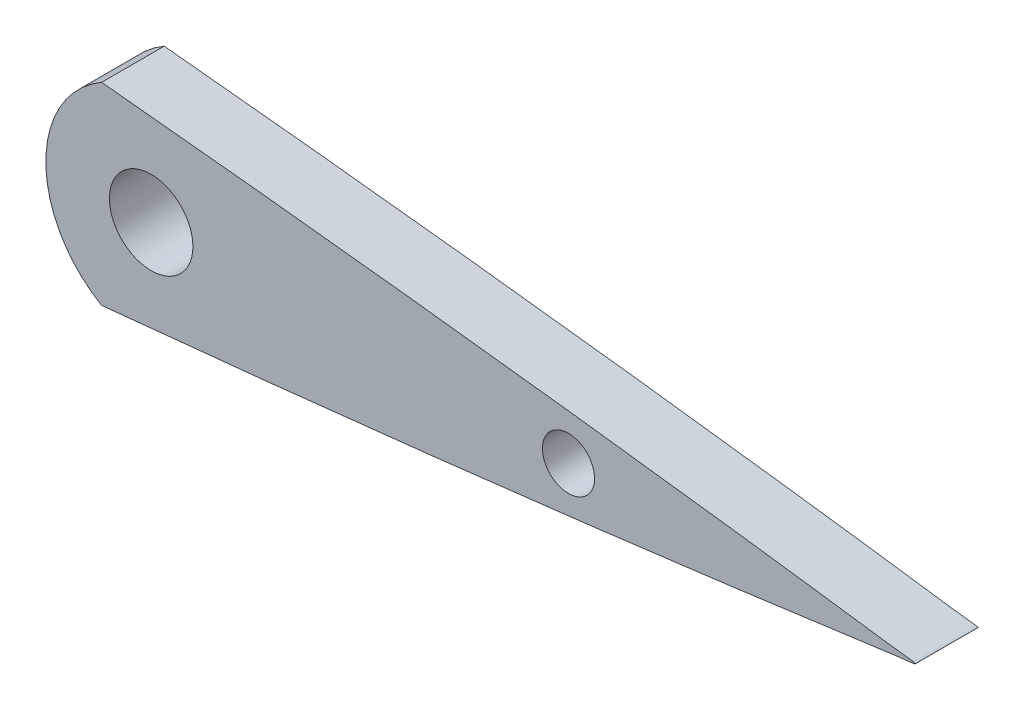
ISO-10303-21;
HEADER;
FILE_DESCRIPTION(('STEP AP214'),'2;1');
FILE_NAME('part.step','',(''),(''),'','','');
FILE_SCHEMA(('AUTOMOTIVE_DESIGN { 1 0 10303 214 1 1 1 1 }'));
ENDSEC;
DATA;
#1=APPLICATION_CONTEXT('core data for automotive mechanical design processes');
#2=APPLICATION_PROTOCOL_DEFINITION('international standard','automotive_design',2000,#1);
#3=PRODUCT_CONTEXT('',#1,'mechanical');
#4=PRODUCT('Part','Part','',(#3));
#5=PRODUCT_RELATED_PRODUCT_CATEGORY('part','',(#4));
#6=PRODUCT_DEFINITION_FORMATION('','',#4);
#7=PRODUCT_DEFINITION_CONTEXT('part definition',#1,'design');
#8=PRODUCT_DEFINITION('design','',#6,#7);
#9=PRODUCT_DEFINITION_SHAPE('','',#8);
#10=(LENGTH_UNIT() NAMED_UNIT(*) SI_UNIT(.MILLI.,.METRE.));
#11=(NAMED_UNIT(*) PLANE_ANGLE_UNIT() SI_UNIT($,.RADIAN.));
#12=(NAMED_UNIT(*) SI_UNIT($,.STERADIAN.) SOLID_ANGLE_UNIT());
#13=UNCERTAINTY_MEASURE_WITH_UNIT(LENGTH_MEASURE(1.E-05),#10,'distance_accuracy_value','');
#14=(GEOMETRIC_REPRESENTATION_CONTEXT(3) GLOBAL_UNCERTAINTY_ASSIGNED_CONTEXT((#13)) GLOBAL_UNIT_ASSIGNED_CONTEXT((#10,
#11,#12)) REPRESENTATION_CONTEXT('',''));
#15=CARTESIAN_POINT('',(0.,0.,0.));
#16=DIRECTION('',(0.,0.,1.));
#17=DIRECTION('',(1.,0.,0.));
#18=AXIS2_PLACEMENT_3D('',#15,#16,#17);
#19=CARTESIAN_POINT('',(183.646130035687,6.18754179837477E-13,6.));
#20=DIRECTION('',(0.,0.,-1.));
#21=DIRECTION('',(-1.,0.,0.));
#22=AXIS2_PLACEMENT_3D('',#19,#20,#21);
#23=CYLINDRICAL_SURFACE('',#22,10.6922600710071);
#24=CARTESIAN_POINT('',(183.646130035687,6.18754179837477E-13,0.));
#25=DIRECTION('',(0.,0.,1.));
#26=DIRECTION('',(1.,0.,0.));
#27=AXIS2_PLACEMENT_3D('',#24,#25,#26);
#28=CIRCLE('',#27,10.6922600710071);
#29=CARTESIAN_POINT('',(178.300000000182,9.25976884536226,0.));
#30=VERTEX_POINT('',#29);
#31=CARTESIAN_POINT('',(178.300000000184,-9.25976884536209,0.));
#32=VERTEX_POINT('',#31);
#33=EDGE_CURVE('E67',#30,#32,#28,.T.);
#34=ORIENTED_EDGE('',*,*,#33,.T.);
#35=DIRECTION('',(0.,0.,-1.));
#36=VECTOR('',#35,1.);
#37=CARTESIAN_POINT('',(178.300000000184,-9.25976884536209,6.));
#38=LINE('',#37,#36);
#39=CARTESIAN_POINT('',(178.300000000184,-9.25976884536209,6.));
#40=VERTEX_POINT('',#39);
#41=EDGE_CURVE('E11',#40,#32,#38,.T.);
#42=ORIENTED_EDGE('',*,*,#41,.F.);
#43=CARTESIAN_POINT('',(183.646130035687,6.18754179837477E-13,6.));
#44=DIRECTION('',(0.,0.,1.));
#45=DIRECTION('',(1.,0.,0.));
#46=AXIS2_PLACEMENT_3D('',#43,#44,#45);
#47=CIRCLE('',#46,10.6922600710071);
#48=CARTESIAN_POINT('',(178.300000000182,9.25976884536226,6.));
#49=VERTEX_POINT('',#48);
#50=EDGE_CURVE('E70',#49,#40,#47,.T.);
#51=ORIENTED_EDGE('',*,*,#50,.F.);
#52=DIRECTION('',(0.,0.,-1.));
#53=VECTOR('',#52,1.);
#54=CARTESIAN_POINT('',(178.300000000182,9.25976884536226,6.));
#55=LINE('',#54,#53);
#56=EDGE_CURVE('E44',#49,#30,#55,.T.);
#57=ORIENTED_EDGE('',*,*,#56,.T.);
#58=EDGE_LOOP('',(#34,#42,#51,#57));
#59=FACE_BOUND('',#58,.T.);
#60=ADVANCED_FACE('F35',(#59),#23,.T.);
#61=CARTESIAN_POINT('',(223.05,0.,6.));
#62=DIRECTION('',(0.,0.,-1.));
#63=DIRECTION('',(-1.,0.,0.));
#64=AXIS2_PLACEMENT_3D('',#61,#62,#63);
#65=CYLINDRICAL_SURFACE('',#64,2.5);
#66=CARTESIAN_POINT('',(223.05,0.,6.));
#67=DIRECTION('',(0.,0.,1.));
#68=DIRECTION('',(1.,0.,0.));
#69=AXIS2_PLACEMENT_3D('',#66,#67,#68);
#70=CIRCLE('',#69,2.5);
#71=CARTESIAN_POINT('',(225.55,0.,6.));
#72=VERTEX_POINT('',#71);
#73=EDGE_CURVE('E119',#72,#72,#70,.T.);
#74=ORIENTED_EDGE('',*,*,#73,.T.);
#75=EDGE_LOOP('',(#74));
#76=FACE_BOUND('',#75,.T.);
#77=CARTESIAN_POINT('',(223.05,0.,0.));
#78=DIRECTION('',(0.,0.,1.));
#79=DIRECTION('',(1.,0.,0.));
#80=AXIS2_PLACEMENT_3D('',#77,#78,#79);
#81=CIRCLE('',#80,2.5);
#82=CARTESIAN_POINT('',(225.55,0.,0.));
#83=VERTEX_POINT('',#82);
#84=EDGE_CURVE('E72',#83,#83,#81,.T.);
#85=ORIENTED_EDGE('',*,*,#84,.F.);
#86=EDGE_LOOP('',(#85));
#87=FACE_BOUND('',#86,.T.);
#88=ADVANCED_FACE('F99',(#76,#87),#65,.F.);
#89=CARTESIAN_POINT('',(183.05,0.,6.));
#90=DIRECTION('',(0.,0.,-1.));
#91=DIRECTION('',(-1.,0.,0.));
#92=AXIS2_PLACEMENT_3D('',#89,#90,#91);
#93=CYLINDRICAL_SURFACE('',#92,3.99999999999999);
#94=CARTESIAN_POINT('',(183.05,0.,6.));
#95=DIRECTION('',(0.,0.,1.));
#96=DIRECTION('',(1.,0.,0.));
#97=AXIS2_PLACEMENT_3D('',#94,#95,#96);
#98=CIRCLE('',#97,3.99999999999999);
#99=CARTESIAN_POINT('',(187.05,0.,6.));
#100=VERTEX_POINT('',#99);
#101=EDGE_CURVE('E66',#100,#100,#98,.T.);
#102=ORIENTED_EDGE('',*,*,#101,.T.);
#103=EDGE_LOOP('',(#102));
#104=FACE_BOUND('',#103,.T.);
#105=CARTESIAN_POINT('',(183.05,0.,0.));
#106=DIRECTION('',(0.,0.,1.));
#107=DIRECTION('',(1.,0.,0.));
#108=AXIS2_PLACEMENT_3D('',#105,#106,#107);
#109=CIRCLE('',#108,3.99999999999999);
#110=CARTESIAN_POINT('',(187.05,0.,0.));
#111=VERTEX_POINT('',#110);
#112=EDGE_CURVE('E75',#111,#111,#109,.T.);
#113=ORIENTED_EDGE('',*,*,#112,.F.);
#114=EDGE_LOOP('',(#113));
#115=FACE_BOUND('',#114,.T.);
#116=ADVANCED_FACE('F37',(#104,#115),#93,.F.);
#117=CARTESIAN_POINT('',(256.3,0.,6.));
#118=CARTESIAN_POINT('',(256.3,0.106670992526282,6.));
#119=CARTESIAN_POINT('',(254.711719333497,0.220284066592443,6.));
#120=CARTESIAN_POINT('',(253.776091935702,0.354769376235053,6.));
#121=CARTESIAN_POINT('',(253.327462597443,0.41690636462591,6.));
#122=CARTESIAN_POINT('',(252.590679654991,0.520240198976876,6.));
#123=CARTESIAN_POINT('',(251.557050418924,0.663986383744315,6.));
#124=CARTESIAN_POINT('',(250.233997703252,0.846504295842154,6.));
#125=CARTESIAN_POINT('',(248.622675623445,1.0680208823038,6.));
#126=CARTESIAN_POINT('',(246.727445016607,1.32614032961468,6.));
#127=CARTESIAN_POINT('',(244.552524456023,1.61919073728249,6.));
#128=CARTESIAN_POINT('',(242.103156271172,1.94591905923202,6.));
#129=CARTESIAN_POINT('',(239.385003595188,2.30397948836878,6.));
#130=CARTESIAN_POINT('',(236.404409250045,2.69169011904553,6.));
#131=CARTESIAN_POINT('',(233.168269854845,3.10593889631728,6.));
#132=CARTESIAN_POINT('',(229.684196629751,3.54567816627796,6.));
#133=CARTESIAN_POINT('',(225.960300671937,4.00783138127008,6.));
#134=CARTESIAN_POINT('',(222.005313282649,4.49000827855852,6.));
#135=CARTESIAN_POINT('',(217.828500466562,4.99005649759548,6.));
#136=CARTESIAN_POINT('',(213.439589198724,5.50536316792759,6.));
#137=CARTESIAN_POINT('',(208.848668706419,6.03284137825824,6.));
#138=CARTESIAN_POINT('',(204.066722569199,6.57114401362941,6.));
#139=CARTESIAN_POINT('',(199.104769105876,7.11640957033715,6.));
#140=CARTESIAN_POINT('',(193.974554517885,7.66717355980137,6.));
#141=CARTESIAN_POINT('',(188.687859690033,8.21950012986293,6.));
#142=CARTESIAN_POINT('',(183.257146413579,8.77236576299425,6.));
#143=CARTESIAN_POINT('',(177.69503159986,9.32150721960099,6.));
#144=CARTESIAN_POINT('',(172.014593304335,9.86519983114953,6.));
#145=CARTESIAN_POINT('',(166.229022591645,10.3996673578184,6.));
#146=CARTESIAN_POINT('',(160.351815771721,10.9231624926343,6.));
#147=CARTESIAN_POINT('',(154.39673528542,11.4313575122601,6.));
#148=CARTESIAN_POINT('',(148.377658826823,11.9219793478391,6.));
#149=CARTESIAN_POINT('',(142.308720286286,12.3918948214474,6.));
#150=CARTESIAN_POINT('',(136.204016555887,12.8373316419569,6.));
#151=CARTESIAN_POINT('',(130.077893929034,13.2554961127011,6.));
#152=CARTESIAN_POINT('',(123.944653005833,13.6430479833962,6.));
#153=CARTESIAN_POINT('',(117.818490266835,13.9962444324347,6.));
#154=CARTESIAN_POINT('',(111.713827176693,14.3122923372939,6.));
#155=CARTESIAN_POINT('',(105.644782109905,14.587741364165,6.));
#156=CARTESIAN_POINT('',(99.6255791877551,14.8195230551838,6.));
#157=CARTESIAN_POINT('',(93.6703664936599,15.0050641910031,6.));
#158=CARTESIAN_POINT('',(87.7930089941826,15.1410643981602,6.));
#159=CARTESIAN_POINT('',(82.0072278661898,15.2251261033142,6.));
#160=CARTESIAN_POINT('',(76.3263952415822,15.2548866574519,6.));
#161=CARTESIAN_POINT('',(70.7638903673113,15.228577620155,6.));
#162=CARTESIAN_POINT('',(65.3327315960223,15.145016117526,6.));
#163=CARTESIAN_POINT('',(60.0456458677119,15.0016768484505,6.));
#164=CARTESIAN_POINT('',(54.9148635508097,14.7991941097511,6.));
#165=CARTESIAN_POINT('',(49.9523566484242,14.5361130440029,6.));
#166=CARTESIAN_POINT('',(45.1696785157381,14.2131709888414,6.));
#167=CARTESIAN_POINT('',(40.5780912700811,13.8304352986969,6.));
#168=CARTESIAN_POINT('',(36.1882700810261,13.3886016193613,6.));
#169=CARTESIAN_POINT('',(32.0104148384541,12.8893460033938,6.));
#170=CARTESIAN_POINT('',(28.0541571405227,12.3346977873834,6.));
#171=CARTESIAN_POINT('',(24.3288169774566,11.7256909043985,6.));
#172=CARTESIAN_POINT('',(20.8429321319607,11.065369068507,6.));
#173=CARTESIAN_POINT('',(17.6045253085648,10.3562151771582,6.));
#174=CARTESIAN_POINT('',(14.6211649310667,9.60063318863152,6.));
#175=CARTESIAN_POINT('',(11.8994432922759,8.80200800023463,6.));
#176=CARTESIAN_POINT('',(9.44536178743417,7.96299182824412,6.));
#177=CARTESIAN_POINT('',(7.26415387736994,7.08648245906464,6.));
#178=CARTESIAN_POINT('',(5.36013736186411,6.17500845275572,6.));
#179=CARTESIAN_POINT('',(3.73693964172385,5.23046745460679,6.));
#180=CARTESIAN_POINT('',(2.39645086202315,4.25446064779456,6.));
#181=CARTESIAN_POINT('',(1.34126121290402,3.24538255443647,6.));
#182=CARTESIAN_POINT('',(0.573915311344219,2.20037462589391,6.));
#183=CARTESIAN_POINT('',(0.104758816048586,1.11432898554663,6.));
#184=CARTESIAN_POINT('',(-0.0510638334555803,0.,6.));
#185=CARTESIAN_POINT('',(0.104758816048586,-1.11432898554663,6.));
#186=CARTESIAN_POINT('',(0.573915311344219,-2.20037462589392,6.));
#187=CARTESIAN_POINT('',(1.34126121290402,-3.24538255443647,6.));
#188=CARTESIAN_POINT('',(2.39645086202317,-4.25446064779457,6.));
#189=CARTESIAN_POINT('',(3.73693964172383,-5.23046745460677,6.));
#190=CARTESIAN_POINT('',(5.36013736186407,-6.17500845275571,6.));
#191=CARTESIAN_POINT('',(7.26415387737003,-7.08648245906468,6.));
#192=CARTESIAN_POINT('',(9.44536178743409,-7.96299182824409,6.));
#193=CARTESIAN_POINT('',(11.899443292276,-8.80200800023464,6.));
#194=CARTESIAN_POINT('',(14.6211649310667,-9.60063318863154,6.));
#195=CARTESIAN_POINT('',(17.6045253085647,-10.3562151771581,6.));
#196=CARTESIAN_POINT('',(20.8429321319607,-11.0653690685071,6.));
#197=CARTESIAN_POINT('',(24.3288169774566,-11.7256909043985,6.));
#198=CARTESIAN_POINT('',(28.0541571405227,-12.3346977873834,6.));
#199=CARTESIAN_POINT('',(32.0104148384541,-12.8893460033938,6.));
#200=CARTESIAN_POINT('',(36.1882700810261,-13.3886016193613,6.));
#201=CARTESIAN_POINT('',(40.5780912700811,-13.8304352986969,6.));
#202=CARTESIAN_POINT('',(45.1696785157382,-14.2131709888414,6.));
#203=CARTESIAN_POINT('',(49.9523566484242,-14.5361130440029,6.));
#204=CARTESIAN_POINT('',(54.9148635508096,-14.7991941097511,6.));
#205=CARTESIAN_POINT('',(60.0456458677119,-15.0016768484505,6.));
#206=CARTESIAN_POINT('',(65.3327315960223,-15.145016117526,6.));
#207=CARTESIAN_POINT('',(70.7638903673112,-15.228577620155,6.));
#208=CARTESIAN_POINT('',(76.3263952415822,-15.2548866574519,6.));
#209=CARTESIAN_POINT('',(82.0072278661899,-15.2251261033142,6.));
#210=CARTESIAN_POINT('',(87.7930089941826,-15.1410643981602,6.));
#211=CARTESIAN_POINT('',(93.6703664936598,-15.0050641910031,6.));
#212=CARTESIAN_POINT('',(99.6255791877552,-14.8195230551838,6.));
#213=CARTESIAN_POINT('',(105.644782109905,-14.587741364165,6.));
#214=CARTESIAN_POINT('',(111.713827176693,-14.3122923372939,6.));
#215=CARTESIAN_POINT('',(117.818490266835,-13.9962444324347,6.));
#216=CARTESIAN_POINT('',(123.944653005833,-13.6430479833962,6.));
#217=CARTESIAN_POINT('',(130.077893929034,-13.2554961127011,6.));
#218=CARTESIAN_POINT('',(136.204016555887,-12.8373316419569,6.));
#219=CARTESIAN_POINT('',(142.308720286286,-12.3918948214474,6.));
#220=CARTESIAN_POINT('',(148.377658826823,-11.9219793478391,6.));
#221=CARTESIAN_POINT('',(154.39673528542,-11.4313575122601,6.));
#222=CARTESIAN_POINT('',(160.351815771721,-10.9231624926343,6.));
#223=CARTESIAN_POINT('',(166.229022591645,-10.3996673578184,6.));
#224=CARTESIAN_POINT('',(172.014593304335,-9.86519983114953,6.));
#225=CARTESIAN_POINT('',(177.69503159986,-9.321507219601,6.));
#226=CARTESIAN_POINT('',(183.257146413579,-8.77236576299424,6.));
#227=CARTESIAN_POINT('',(188.687859690033,-8.21950012986294,6.));
#228=CARTESIAN_POINT('',(193.974554517885,-7.66717355980138,6.));
#229=CARTESIAN_POINT('',(199.104769105876,-7.11640957033714,6.));
#230=CARTESIAN_POINT('',(204.066722569199,-6.57114401362941,6.));
#231=CARTESIAN_POINT('',(208.848668706419,-6.03284137825824,6.));
#232=CARTESIAN_POINT('',(213.439589198724,-5.5053631679276,6.));
#233=CARTESIAN_POINT('',(217.828500466562,-4.99005649759547,6.));
#234=CARTESIAN_POINT('',(222.005313282649,-4.49000827855852,6.));
#235=CARTESIAN_POINT('',(225.960300671937,-4.00783138127007,6.));
#236=CARTESIAN_POINT('',(229.684196629751,-3.54567816627797,6.));
#237=CARTESIAN_POINT('',(233.168269854845,-3.10593889631728,6.));
#238=CARTESIAN_POINT('',(236.404409250045,-2.69169011904553,6.));
#239=CARTESIAN_POINT('',(239.385003595188,-2.30397948836877,6.));
#240=CARTESIAN_POINT('',(242.103156271172,-1.94591905923202,6.));
#241=CARTESIAN_POINT('',(244.552524456023,-1.61919073728249,6.));
#242=CARTESIAN_POINT('',(246.727445016608,-1.32614032961469,6.));
#243=CARTESIAN_POINT('',(248.622675623445,-1.0680208823038,6.));
#244=CARTESIAN_POINT('',(250.233997703252,-0.846504295842156,6.));
#245=CARTESIAN_POINT('',(251.557050418924,-0.663986383744307,6.));
#246=CARTESIAN_POINT('',(252.590679654991,-0.520240198976875,6.));
#247=CARTESIAN_POINT('',(253.327462597443,-0.416906364625911,6.));
#248=CARTESIAN_POINT('',(253.776091935702,-0.354769376235056,6.));
#249=CARTESIAN_POINT('',(254.711719333497,-0.220284066592434,6.));
#250=CARTESIAN_POINT('',(256.3,-0.10667099252628,6.));
#251=CARTESIAN_POINT('',(256.3,0.,6.));
#252=B_SPLINE_CURVE_WITH_KNOTS('',3,(#117,#118,#119,#120,#121,#122,#123,#124,#125,#126,#127,
#128,#129,#130,#131,#132,#133,#134,#135,#136,#137,#138,#139,#140,#141,#142,#143,#144,#145,#146,
#147,#148,#149,#150,#151,#152,#153,#154,#155,#156,#157,#158,#159,#160,#161,#162,#163,#164,#165,
#166,#167,#168,#169,#170,#171,#172,#173,#174,#175,#176,#177,#178,#179,#180,#181,#182,#183,#184,
#185,#186,#187,#188,#189,#190,#191,#192,#193,#194,#195,#196,#197,#198,#199,#200,#201,#202,#203,
#204,#205,#206,#207,#208,#209,#210,#211,#212,#213,#214,#215,#216,#217,#218,#219,#220,#221,#222,
#223,#224,#225,#226,#227,#228,#229,#230,#231,#232,#233,#234,#235,#236,#237,#238,#239,#240,#241,
#242,#243,#244,#245,#246,#247,#248,#249,#250,#251),.UNSPECIFIED.,.T.,.F.,(4,1,1,1,1,1,1,1,1,1,1,
1,1,1,1,1,1,1,1,1,1,1,1,1,1,1,1,1,1,1,1,1,1,1,1,1,1,1,1,1,1,1,1,1,1,1,1,1,1,1,1,1,1,1,1,1,1,1,1,
1,1,1,1,1,1,1,1,1,1,1,1,1,1,1,1,1,1,1,1,1,1,1,1,1,1,1,1,1,1,1,1,1,1,1,1,1,1,1,1,1,1,1,1,1,1,1,1,
1,1,1,1,1,1,1,1,1,1,1,1,1,1,1,1,1,1,1,1,1,1,1,1,1,4),(0.,0.00440467882447803,
0.00469133257009648,0.00555026346629306,0.00697995997686531,0.00897636959243701,
0.0115348259817959,0.0146494199884388,0.0183124681132854,0.0225153298127409,0.0272475069764787,
0.0324978968299384,0.0382539578086903,0.0445020672453837,0.0512268693704912,0.0584133136899083,
0.0660434673853011,0.074098984177092,0.0825619520551814,0.0914115185810414,0.1006270091212,
0.110186574665009,0.120067574979074,0.130246743110962,0.140700546495591,0.151404252230145,
0.162331841942182,0.173458675499212,0.184758289796063,0.196204075881576,0.207768617586395,
0.219425944850675,0.231147635136584,0.242906359356269,0.254675296370391,0.266426209597286,
0.278132454826831,0.289766476815946,0.30130181394516,0.31271164589075,0.32396925896078,
0.335050049690259,0.345928598546206,0.356580621263919,0.36698199611688,0.377109775969666,
0.386942118772499,0.396457905020317,0.405636644873152,0.414459070098341,0.422906620433867,
0.430962851253166,0.438611617881967,0.44583827498756,0.452630376832866,0.458976172586593,
0.464866300153343,0.470293867967309,0.475254828843913,0.479749124233171,0.483781005916935,
0.487362579765538,0.490515631726242,0.493278565848467,0.495712194393612,0.497909944006307,0.5,
0.502090055993693,0.504287805606388,0.506721434151533,0.509484368273758,0.512637420234462,
0.516218994083065,0.520250875766829,0.524745171156087,0.52970613203269,0.535133699846657,
0.541023827413407,0.547369623167134,0.55416172501244,0.561388382118033,0.569037148746834,
0.577093379566133,0.585540929901659,0.594363355126848,0.603542094979683,0.613057881227501,
0.622890224030334,0.63301800388312,0.643419378736081,0.654071401453794,0.664949950309741,
0.676030741039219,0.68728835410925,0.69869818605484,0.710233523184054,0.721867545173169,
0.733573790402714,0.745324703629609,0.757093640643731,0.768852364863416,0.780574055149325,
0.792231382413605,0.803795924118424,0.815241710203937,0.826541324500788,0.837668158057818,
0.848595747769855,0.85929945350441,0.869753256889038,0.879932425020926,0.889813425334991,
0.8993729908788,0.908588481418959,0.917438047944819,0.925901015822908,0.933956532614699,
0.941586686310092,0.948773130629509,0.955497932754616,0.96174604219131,0.967502103170062,
0.972752493023521,0.977484670187259,0.981687531886715,0.985350580011561,0.988465174018204,
0.991023630407563,0.993020040023135,0.994449736533707,0.995308667429904,0.995595321175522,1.),.UNSPECIFIED.);
#253=DIRECTION('',(0.,0.,-1.));
#254=VECTOR('',#253,1.);
#255=SURFACE_OF_LINEAR_EXTRUSION('',#252,#254);
#256=CARTESIAN_POINT('',(256.3,0.,0.));
#257=CARTESIAN_POINT('',(256.3,0.106670992526282,0.));
#258=CARTESIAN_POINT('',(254.711719333497,0.220284066592443,0.));
#259=CARTESIAN_POINT('',(253.776091935702,0.354769376235053,0.));
#260=CARTESIAN_POINT('',(253.327462597443,0.41690636462591,0.));
#261=CARTESIAN_POINT('',(252.590679654991,0.520240198976876,0.));
#262=CARTESIAN_POINT('',(251.557050418924,0.663986383744315,0.));
#263=CARTESIAN_POINT('',(250.233997703252,0.846504295842154,0.));
#264=CARTESIAN_POINT('',(248.622675623445,1.0680208823038,0.));
#265=CARTESIAN_POINT('',(246.727445016607,1.32614032961468,0.));
#266=CARTESIAN_POINT('',(244.552524456023,1.61919073728249,0.));
#267=CARTESIAN_POINT('',(242.103156271172,1.94591905923202,0.));
#268=CARTESIAN_POINT('',(239.385003595188,2.30397948836878,0.));
#269=CARTESIAN_POINT('',(236.404409250045,2.69169011904553,0.));
#270=CARTESIAN_POINT('',(233.168269854845,3.10593889631728,0.));
#271=CARTESIAN_POINT('',(229.684196629751,3.54567816627796,0.));
#272=CARTESIAN_POINT('',(225.960300671937,4.00783138127008,0.));
#273=CARTESIAN_POINT('',(222.005313282649,4.49000827855852,0.));
#274=CARTESIAN_POINT('',(217.828500466562,4.99005649759548,0.));
#275=CARTESIAN_POINT('',(213.439589198724,5.50536316792759,0.));
#276=CARTESIAN_POINT('',(208.848668706419,6.03284137825824,0.));
#277=CARTESIAN_POINT('',(204.066722569199,6.57114401362941,0.));
#278=CARTESIAN_POINT('',(199.104769105876,7.11640957033715,0.));
#279=CARTESIAN_POINT('',(193.974554517885,7.66717355980137,0.));
#280=CARTESIAN_POINT('',(188.687859690033,8.21950012986293,0.));
#281=CARTESIAN_POINT('',(183.257146413579,8.77236576299425,0.));
#282=CARTESIAN_POINT('',(177.69503159986,9.32150721960099,0.));
#283=CARTESIAN_POINT('',(172.014593304335,9.86519983114953,0.));
#284=CARTESIAN_POINT('',(166.229022591645,10.3996673578184,0.));
#285=CARTESIAN_POINT('',(160.351815771721,10.9231624926343,0.));
#286=CARTESIAN_POINT('',(154.39673528542,11.4313575122601,0.));
#287=CARTESIAN_POINT('',(148.377658826823,11.9219793478391,0.));
#288=CARTESIAN_POINT('',(142.308720286286,12.3918948214474,0.));
#289=CARTESIAN_POINT('',(136.204016555887,12.8373316419569,0.));
#290=CARTESIAN_POINT('',(130.077893929034,13.2554961127011,0.));
#291=CARTESIAN_POINT('',(123.944653005833,13.6430479833962,0.));
#292=CARTESIAN_POINT('',(117.818490266835,13.9962444324347,0.));
#293=CARTESIAN_POINT('',(111.713827176693,14.3122923372939,0.));
#294=CARTESIAN_POINT('',(105.644782109905,14.587741364165,0.));
#295=CARTESIAN_POINT('',(99.6255791877551,14.8195230551838,0.));
#296=CARTESIAN_POINT('',(93.6703664936599,15.0050641910031,0.));
#297=CARTESIAN_POINT('',(87.7930089941826,15.1410643981602,0.));
#298=CARTESIAN_POINT('',(82.0072278661898,15.2251261033142,0.));
#299=CARTESIAN_POINT('',(76.3263952415822,15.2548866574519,0.));
#300=CARTESIAN_POINT('',(70.7638903673113,15.228577620155,0.));
#301=CARTESIAN_POINT('',(65.3327315960223,15.145016117526,0.));
#302=CARTESIAN_POINT('',(60.0456458677119,15.0016768484505,0.));
#303=CARTESIAN_POINT('',(54.9148635508097,14.7991941097511,0.));
#304=CARTESIAN_POINT('',(49.9523566484242,14.5361130440029,0.));
#305=CARTESIAN_POINT('',(45.1696785157381,14.2131709888414,0.));
#306=CARTESIAN_POINT('',(40.5780912700811,13.8304352986969,0.));
#307=CARTESIAN_POINT('',(36.1882700810261,13.3886016193613,0.));
#308=CARTESIAN_POINT('',(32.0104148384541,12.8893460033938,0.));
#309=CARTESIAN_POINT('',(28.0541571405227,12.3346977873834,0.));
#310=CARTESIAN_POINT('',(24.3288169774566,11.7256909043985,0.));
#311=CARTESIAN_POINT('',(20.8429321319607,11.065369068507,0.));
#312=CARTESIAN_POINT('',(17.6045253085648,10.3562151771582,0.));
#313=CARTESIAN_POINT('',(14.6211649310667,9.60063318863152,0.));
#314=CARTESIAN_POINT('',(11.8994432922759,8.80200800023463,0.));
#315=CARTESIAN_POINT('',(9.44536178743417,7.96299182824412,0.));
#316=CARTESIAN_POINT('',(7.26415387736994,7.08648245906464,0.));
#317=CARTESIAN_POINT('',(5.36013736186411,6.17500845275572,0.));
#318=CARTESIAN_POINT('',(3.73693964172385,5.23046745460679,0.));
#319=CARTESIAN_POINT('',(2.39645086202315,4.25446064779456,0.));
#320=CARTESIAN_POINT('',(1.34126121290402,3.24538255443647,0.));
#321=CARTESIAN_POINT('',(0.573915311344219,2.20037462589391,0.));
#322=CARTESIAN_POINT('',(0.104758816048586,1.11432898554663,0.));
#323=CARTESIAN_POINT('',(-0.0510638334555803,0.,0.));
#324=CARTESIAN_POINT('',(0.104758816048586,-1.11432898554663,0.));
#325=CARTESIAN_POINT('',(0.573915311344219,-2.20037462589392,0.));
#326=CARTESIAN_POINT('',(1.34126121290402,-3.24538255443647,0.));
#327=CARTESIAN_POINT('',(2.39645086202317,-4.25446064779457,0.));
#328=CARTESIAN_POINT('',(3.73693964172383,-5.23046745460677,0.));
#329=CARTESIAN_POINT('',(5.36013736186407,-6.17500845275571,0.));
#330=CARTESIAN_POINT('',(7.26415387737003,-7.08648245906468,0.));
#331=CARTESIAN_POINT('',(9.44536178743409,-7.96299182824409,0.));
#332=CARTESIAN_POINT('',(11.899443292276,-8.80200800023464,0.));
#333=CARTESIAN_POINT('',(14.6211649310667,-9.60063318863154,0.));
#334=CARTESIAN_POINT('',(17.6045253085647,-10.3562151771581,0.));
#335=CARTESIAN_POINT('',(20.8429321319607,-11.0653690685071,0.));
#336=CARTESIAN_POINT('',(24.3288169774566,-11.7256909043985,0.));
#337=CARTESIAN_POINT('',(28.0541571405227,-12.3346977873834,0.));
#338=CARTESIAN_POINT('',(32.0104148384541,-12.8893460033938,0.));
#339=CARTESIAN_POINT('',(36.1882700810261,-13.3886016193613,0.));
#340=CARTESIAN_POINT('',(40.5780912700811,-13.8304352986969,0.));
#341=CARTESIAN_POINT('',(45.1696785157382,-14.2131709888414,0.));
#342=CARTESIAN_POINT('',(49.9523566484242,-14.5361130440029,0.));
#343=CARTESIAN_POINT('',(54.9148635508096,-14.7991941097511,0.));
#344=CARTESIAN_POINT('',(60.0456458677119,-15.0016768484505,0.));
#345=CARTESIAN_POINT('',(65.3327315960223,-15.145016117526,0.));
#346=CARTESIAN_POINT('',(70.7638903673112,-15.228577620155,0.));
#347=CARTESIAN_POINT('',(76.3263952415822,-15.2548866574519,0.));
#348=CARTESIAN_POINT('',(82.0072278661899,-15.2251261033142,0.));
#349=CARTESIAN_POINT('',(87.7930089941826,-15.1410643981602,0.));
#350=CARTESIAN_POINT('',(93.6703664936598,-15.0050641910031,0.));
#351=CARTESIAN_POINT('',(99.6255791877552,-14.8195230551838,0.));
#352=CARTESIAN_POINT('',(105.644782109905,-14.587741364165,0.));
#353=CARTESIAN_POINT('',(111.713827176693,-14.3122923372939,0.));
#354=CARTESIAN_POINT('',(117.818490266835,-13.9962444324347,0.));
#355=CARTESIAN_POINT('',(123.944653005833,-13.6430479833962,0.));
#356=CARTESIAN_POINT('',(130.077893929034,-13.2554961127011,0.));
#357=CARTESIAN_POINT('',(136.204016555887,-12.8373316419569,0.));
#358=CARTESIAN_POINT('',(142.308720286286,-12.3918948214474,0.));
#359=CARTESIAN_POINT('',(148.377658826823,-11.9219793478391,0.));
#360=CARTESIAN_POINT('',(154.39673528542,-11.4313575122601,0.));
#361=CARTESIAN_POINT('',(160.351815771721,-10.9231624926343,0.));
#362=CARTESIAN_POINT('',(166.229022591645,-10.3996673578184,0.));
#363=CARTESIAN_POINT('',(172.014593304335,-9.86519983114953,0.));
#364=CARTESIAN_POINT('',(177.69503159986,-9.321507219601,0.));
#365=CARTESIAN_POINT('',(183.257146413579,-8.77236576299424,0.));
#366=CARTESIAN_POINT('',(188.687859690033,-8.21950012986294,0.));
#367=CARTESIAN_POINT('',(193.974554517885,-7.66717355980138,0.));
#368=CARTESIAN_POINT('',(199.104769105876,-7.11640957033714,0.));
#369=CARTESIAN_POINT('',(204.066722569199,-6.57114401362941,0.));
#370=CARTESIAN_POINT('',(208.848668706419,-6.03284137825824,0.));
#371=CARTESIAN_POINT('',(213.439589198724,-5.5053631679276,0.));
#372=CARTESIAN_POINT('',(217.828500466562,-4.99005649759547,0.));
#373=CARTESIAN_POINT('',(222.005313282649,-4.49000827855852,0.));
#374=CARTESIAN_POINT('',(225.960300671937,-4.00783138127007,0.));
#375=CARTESIAN_POINT('',(229.684196629751,-3.54567816627797,0.));
#376=CARTESIAN_POINT('',(233.168269854845,-3.10593889631728,0.));
#377=CARTESIAN_POINT('',(236.404409250045,-2.69169011904553,0.));
#378=CARTESIAN_POINT('',(239.385003595188,-2.30397948836877,0.));
#379=CARTESIAN_POINT('',(242.103156271172,-1.94591905923202,0.));
#380=CARTESIAN_POINT('',(244.552524456023,-1.61919073728249,0.));
#381=CARTESIAN_POINT('',(246.727445016608,-1.32614032961469,0.));
#382=CARTESIAN_POINT('',(248.622675623445,-1.0680208823038,0.));
#383=CARTESIAN_POINT('',(250.233997703252,-0.846504295842156,0.));
#384=CARTESIAN_POINT('',(251.557050418924,-0.663986383744307,0.));
#385=CARTESIAN_POINT('',(252.590679654991,-0.520240198976875,0.));
#386=CARTESIAN_POINT('',(253.327462597443,-0.416906364625911,0.));
#387=CARTESIAN_POINT('',(253.776091935702,-0.354769376235056,0.));
#388=CARTESIAN_POINT('',(254.711719333497,-0.220284066592434,0.));
#389=CARTESIAN_POINT('',(256.3,-0.10667099252628,0.));
#390=CARTESIAN_POINT('',(256.3,0.,0.));
#391=B_SPLINE_CURVE_WITH_KNOTS('',3,(#256,#257,#258,#259,#260,#261,#262,#263,#264,#265,#266,
#267,#268,#269,#270,#271,#272,#273,#274,#275,#276,#277,#278,#279,#280,#281,#282,#283,#284,#285,
#286,#287,#288,#289,#290,#291,#292,#293,#294,#295,#296,#297,#298,#299,#300,#301,#302,#303,#304,
#305,#306,#307,#308,#309,#310,#311,#312,#313,#314,#315,#316,#317,#318,#319,#320,#321,#322,#323,
#324,#325,#326,#327,#328,#329,#330,#331,#332,#333,#334,#335,#336,#337,#338,#339,#340,#341,#342,
#343,#344,#345,#346,#347,#348,#349,#350,#351,#352,#353,#354,#355,#356,#357,#358,#359,#360,#361,
#362,#363,#364,#365,#366,#367,#368,#369,#370,#371,#372,#373,#374,#375,#376,#377,#378,#379,#380,
#381,#382,#383,#384,#385,#386,#387,#388,#389,#390),.UNSPECIFIED.,.T.,.F.,(4,1,1,1,1,1,1,1,1,1,1,
1,1,1,1,1,1,1,1,1,1,1,1,1,1,1,1,1,1,1,1,1,1,1,1,1,1,1,1,1,1,1,1,1,1,1,1,1,1,1,1,1,1,1,1,1,1,1,1,
1,1,1,1,1,1,1,1,1,1,1,1,1,1,1,1,1,1,1,1,1,1,1,1,1,1,1,1,1,1,1,1,1,1,1,1,1,1,1,1,1,1,1,1,1,1,1,1,
1,1,1,1,1,1,1,1,1,1,1,1,1,1,1,1,1,1,1,1,1,1,1,1,1,4),(0.,0.00440467882447803,
0.00469133257009648,0.00555026346629306,0.00697995997686531,0.00897636959243701,
0.0115348259817959,0.0146494199884388,0.0183124681132854,0.0225153298127409,0.0272475069764787,
0.0324978968299384,0.0382539578086903,0.0445020672453837,0.0512268693704912,0.0584133136899083,
0.0660434673853011,0.074098984177092,0.0825619520551814,0.0914115185810414,0.1006270091212,
0.110186574665009,0.120067574979074,0.130246743110962,0.140700546495591,0.151404252230145,
0.162331841942182,0.173458675499212,0.184758289796063,0.196204075881576,0.207768617586395,
0.219425944850675,0.231147635136584,0.242906359356269,0.254675296370391,0.266426209597286,
0.278132454826831,0.289766476815946,0.30130181394516,0.31271164589075,0.32396925896078,
0.335050049690259,0.345928598546206,0.356580621263919,0.36698199611688,0.377109775969666,
0.386942118772499,0.396457905020317,0.405636644873152,0.414459070098341,0.422906620433867,
0.430962851253166,0.438611617881967,0.44583827498756,0.452630376832866,0.458976172586593,
0.464866300153343,0.470293867967309,0.475254828843913,0.479749124233171,0.483781005916935,
0.487362579765538,0.490515631726242,0.493278565848467,0.495712194393612,0.497909944006307,0.5,
0.502090055993693,0.504287805606388,0.506721434151533,0.509484368273758,0.512637420234462,
0.516218994083065,0.520250875766829,0.524745171156087,0.52970613203269,0.535133699846657,
0.541023827413407,0.547369623167134,0.55416172501244,0.561388382118033,0.569037148746834,
0.577093379566133,0.585540929901659,0.594363355126848,0.603542094979683,0.613057881227501,
0.622890224030334,0.63301800388312,0.643419378736081,0.654071401453794,0.664949950309741,
0.676030741039219,0.68728835410925,0.69869818605484,0.710233523184054,0.721867545173169,
0.733573790402714,0.745324703629609,0.757093640643731,0.768852364863416,0.780574055149325,
0.792231382413605,0.803795924118424,0.815241710203937,0.826541324500788,0.837668158057818,
0.848595747769855,0.85929945350441,0.869753256889038,0.879932425020926,0.889813425334991,
0.8993729908788,0.908588481418959,0.917438047944819,0.925901015822908,0.933956532614699,
0.941586686310092,0.948773130629509,0.955497932754616,0.96174604219131,0.967502103170062,
0.972752493023521,0.977484670187259,0.981687531886715,0.985350580011561,0.988465174018204,
0.991023630407563,0.993020040023135,0.994449736533707,0.995308667429904,0.995595321175522,1.),.UNSPECIFIED.);
#392=EDGE_CURVE('E59',#32,#30,#391,.T.);
#393=ORIENTED_EDGE('',*,*,#392,.T.);
#394=ORIENTED_EDGE('',*,*,#56,.F.);
#395=EDGE_CURVE('E51',#40,#49,#252,.T.);
#396=ORIENTED_EDGE('',*,*,#395,.F.);
#397=ORIENTED_EDGE('',*,*,#41,.T.);
#398=EDGE_LOOP('',(#393,#394,#396,#397));
#399=FACE_BOUND('',#398,.T.);
#400=ADVANCED_FACE('F62',(#399),#255,.F.);
#401=CARTESIAN_POINT('',(0.,0.,0.));
#402=DIRECTION('',(0.,0.,1.));
#403=DIRECTION('',(1.,0.,0.));
#404=AXIS2_PLACEMENT_3D('',#401,#402,#403);
#405=PLANE('',#404);
#406=ORIENTED_EDGE('',*,*,#112,.T.);
#407=EDGE_LOOP('',(#406));
#408=FACE_BOUND('',#407,.T.);
#409=ORIENTED_EDGE('',*,*,#84,.T.);
#410=EDGE_LOOP('',(#409));
#411=FACE_BOUND('',#410,.T.);
#412=ORIENTED_EDGE('',*,*,#33,.F.);
#413=ORIENTED_EDGE('',*,*,#392,.F.);
#414=EDGE_LOOP('',(#412,#413));
#415=FACE_BOUND('',#414,.T.);
#416=ADVANCED_FACE('F71',(#408,#411,#415),#405,.F.);
#417=CARTESIAN_POINT('',(0.,0.,6.));
#418=DIRECTION('',(0.,0.,1.));
#419=DIRECTION('',(1.,0.,0.));
#420=AXIS2_PLACEMENT_3D('',#417,#418,#419);
#421=PLANE('',#420);
#422=ORIENTED_EDGE('',*,*,#101,.F.);
#423=EDGE_LOOP('',(#422));
#424=FACE_BOUND('',#423,.T.);
#425=ORIENTED_EDGE('',*,*,#73,.F.);
#426=EDGE_LOOP('',(#425));
#427=FACE_BOUND('',#426,.T.);
#428=ORIENTED_EDGE('',*,*,#50,.T.);
#429=ORIENTED_EDGE('',*,*,#395,.T.);
#430=EDGE_LOOP('',(#428,#429));
#431=FACE_BOUND('',#430,.T.);
#432=ADVANCED_FACE('F100',(#424,#427,#431),#421,.T.);
#433=CLOSED_SHELL('',(#60,#88,#116,#400,#416,#432));
#434=MANIFOLD_SOLID_BREP('B2',#433);
#435=ADVANCED_BREP_SHAPE_REPRESENTATION('',(#18,#434),#14);
#436=SHAPE_DEFINITION_REPRESENTATION(#9,#435);
ENDSEC;
END-ISO-10303-21;
